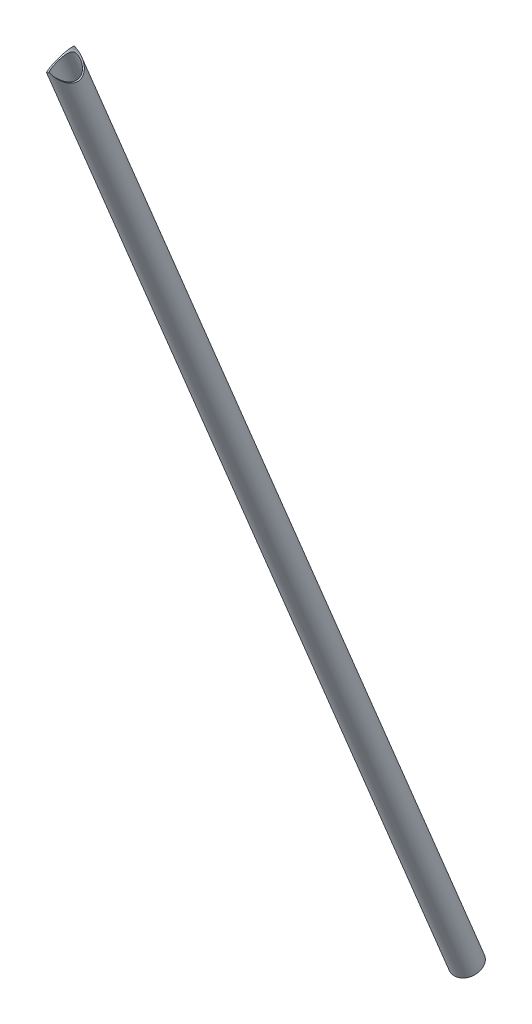
ISO-10303-21;
HEADER;
FILE_DESCRIPTION(('STEP AP214'),'2;1');
FILE_NAME('part.step','',(''),(''),'','','');
FILE_SCHEMA(('AUTOMOTIVE_DESIGN { 1 0 10303 214 1 1 1 1 }'));
ENDSEC;
DATA;
#1=APPLICATION_CONTEXT('core data for automotive mechanical design processes');
#2=APPLICATION_PROTOCOL_DEFINITION('international standard','automotive_design',2000,#1);
#3=PRODUCT_CONTEXT('',#1,'mechanical');
#4=PRODUCT('Part','Part','',(#3));
#5=PRODUCT_RELATED_PRODUCT_CATEGORY('part','',(#4));
#6=PRODUCT_DEFINITION_FORMATION('','',#4);
#7=PRODUCT_DEFINITION_CONTEXT('part definition',#1,'design');
#8=PRODUCT_DEFINITION('design','',#6,#7);
#9=PRODUCT_DEFINITION_SHAPE('','',#8);
#10=(LENGTH_UNIT() NAMED_UNIT(*) SI_UNIT(.MILLI.,.METRE.));
#11=(NAMED_UNIT(*) PLANE_ANGLE_UNIT() SI_UNIT($,.RADIAN.));
#12=(NAMED_UNIT(*) SI_UNIT($,.STERADIAN.) SOLID_ANGLE_UNIT());
#13=UNCERTAINTY_MEASURE_WITH_UNIT(LENGTH_MEASURE(1.E-05),#10,'distance_accuracy_value','');
#14=(GEOMETRIC_REPRESENTATION_CONTEXT(3) GLOBAL_UNCERTAINTY_ASSIGNED_CONTEXT((#13)) GLOBAL_UNIT_ASSIGNED_CONTEXT((#10,
#11,#12)) REPRESENTATION_CONTEXT('',''));
#15=CARTESIAN_POINT('',(0.,0.,0.));
#16=DIRECTION('',(0.,0.,1.));
#17=DIRECTION('',(1.,0.,0.));
#18=AXIS2_PLACEMENT_3D('',#15,#16,#17);
#19=CARTESIAN_POINT('',(-1.11022302462516E-13,220.,-2300.));
#20=DIRECTION('',(0.,0.924802742541058,0.380446957391614));
#21=DIRECTION('',(0.,-0.380446957391614,0.924802742541059));
#22=AXIS2_PLACEMENT_3D('',#19,#20,#21);
#23=CYLINDRICAL_SURFACE('',#22,9.79999999999998);
#24=CARTESIAN_POINT('',(-1.11022302462516E-13,220.,-2300.));
#25=DIRECTION('',(0.,-0.924802742541059,-0.380446957391614));
#26=DIRECTION('',(-0.14944830444176,0.376174363259909,-0.914416782832361));
#27=AXIS2_PLACEMENT_3D('',#24,#25,#26);
#28=CIRCLE('',#27,9.79999999999998);
#29=CARTESIAN_POINT('',(-1.46459338352935,223.686508759947,-2308.96128447176));
#30=VERTEX_POINT('',#29);
#31=EDGE_CURVE('E91',#30,#30,#28,.T.);
#32=ORIENTED_EDGE('',*,*,#31,.T.);
#33=EDGE_LOOP('',(#32));
#34=FACE_BOUND('',#33,.T.);
#35=CARTESIAN_POINT('',(-9.60359023693024,1006.91257135328,-1978.38946943885));
#36=CARTESIAN_POINT('',(-9.64365230444011,1006.7976589944,-1978.22363917368));
#37=CARTESIAN_POINT('',(-9.67786894181936,1006.68679053126,-1978.05359784801));
#38=CARTESIAN_POINT('',(-9.73402261334779,1006.47429744609,-1977.70589373125));
#39=CARTESIAN_POINT('',(-9.75596152261964,1006.37267141448,-1977.52823210843));
#40=CARTESIAN_POINT('',(-9.78712370062363,1006.17975912841,-1977.16637275888));
#41=CARTESIAN_POINT('',(-9.79635144677813,1006.08846924353,-1976.98217735709));
#42=CARTESIAN_POINT('',(-9.80187628969414,1005.91710717101,-1976.60844234207));
#43=CARTESIAN_POINT('',(-9.79817322156801,1005.83703512642,-1976.41890266074));
#44=CARTESIAN_POINT('',(-9.77783418073081,1005.68875926246,-1976.03575449786));
#45=CARTESIAN_POINT('',(-9.76118864382762,1005.62056426558,-1975.8421431104));
#46=CARTESIAN_POINT('',(-9.71520143312278,1005.49655471192,-1975.45248616531));
#47=CARTESIAN_POINT('',(-9.68585973013293,1005.4407401836,-1975.25644060207));
#48=CARTESIAN_POINT('',(-9.61493850035152,1005.34163304488,-1974.86334998296));
#49=CARTESIAN_POINT('',(-9.57335536684509,1005.29834413239,-1974.66630464936));
#50=CARTESIAN_POINT('',(-9.47860134200897,1005.2241919245,-1974.27267869454));
#51=CARTESIAN_POINT('',(-9.42543022907206,1005.19332886677,-1974.07609808228));
#52=CARTESIAN_POINT('',(-9.30872646590862,1005.14387380877,-1973.68620975318));
#53=CARTESIAN_POINT('',(-9.2452792762201,1005.12518649253,-1973.49288844494));
#54=CARTESIAN_POINT('',(-9.10853137672886,1005.09915724794,-1973.10896103572));
#55=CARTESIAN_POINT('',(-9.03522697608594,1005.09181958217,-1972.91835598149));
#56=CARTESIAN_POINT('',(-8.80175204371721,1005.08589841729,-1972.35201152867));
#57=CARTESIAN_POINT('',(-8.62795984668388,1005.10338322415,-1971.98154608296));
#58=CARTESIAN_POINT('',(-8.29439092746783,1005.16681325646,-1971.34438985109));
#59=CARTESIAN_POINT('',(-8.14074167962456,1005.20520091917,-1971.07358873513));
#60=CARTESIAN_POINT('',(-7.81791986530369,1005.30082519699,-1970.5446954976));
#61=CARTESIAN_POINT('',(-7.64874013015978,1005.35807054843,-1970.28660933039));
#62=CARTESIAN_POINT('',(-7.29629099146843,1005.48880098163,-1969.78363799283));
#63=CARTESIAN_POINT('',(-7.1129870810591,1005.56232671467,-1969.5387878104));
#64=CARTESIAN_POINT('',(-6.73396357684742,1005.72282639638,-1969.06364950693));
#65=CARTESIAN_POINT('',(-6.53824588370323,1005.80979828925,-1968.83335916738));
#66=CARTESIAN_POINT('',(-6.12925386537519,1005.99724251228,-1968.3813803));
#67=CARTESIAN_POINT('',(-5.91563421438959,1006.09803428041,-1968.16013768123));
#68=CARTESIAN_POINT('',(-5.4761894957211,1006.30810026514,-1967.7343236747));
#69=CARTESIAN_POINT('',(-5.25036125974204,1006.41737668688,-1967.52975664937));
#70=CARTESIAN_POINT('',(-4.78656616745733,1006.6407937774,-1967.13886890613));
#71=CARTESIAN_POINT('',(-4.54862497133501,1006.7549240856,-1966.95251187363));
#72=CARTESIAN_POINT('',(-4.05908743561433,1006.98402326998,-1966.59950578165));
#73=CARTESIAN_POINT('',(-3.80749936441947,1007.09899160266,-1966.43284497893));
#74=CARTESIAN_POINT('',(-3.29012151839071,1007.32333785652,-1966.12327004089));
#75=CARTESIAN_POINT('',(-3.02443550419145,1007.4327474498,-1965.98020758196));
#76=CARTESIAN_POINT('',(-2.47473125878425,1007.63833312369,-1965.72188273374));
#77=CARTESIAN_POINT('',(-2.19072143102497,1007.73451520805,-1965.60660771418));
#78=CARTESIAN_POINT('',(-1.6500359946442,1007.88736469091,-1965.42844320705));
#79=CARTESIAN_POINT('',(-1.39637267358888,1007.94790756608,-1965.36009559887));
#80=CARTESIAN_POINT('',(-1.00749870489637,1008.01780394421,-1965.28221667969));
#81=CARTESIAN_POINT('',(-0.876592393317288,1008.03760843906,-1965.26037225394));
#82=CARTESIAN_POINT('',(-0.612678463472137,1008.06927082178,-1965.22560430281));
#83=CARTESIAN_POINT('',(-0.479671968812604,1008.08113282069,-1965.21267616224));
#84=CARTESIAN_POINT('',(-0.211395102544576,1008.09627158912,-1965.19619637225));
#85=CARTESIAN_POINT('',(-0.0761151125296333,1008.09947149905,-1965.19272866411));
#86=CARTESIAN_POINT('',(0.19425028776987,1008.09685983107,-1965.19556496999));
#87=CARTESIAN_POINT('',(0.329335699313569,1008.09104831173,-1965.2018689205));
#88=CARTESIAN_POINT('',(0.598247733140953,1008.07077146161,-1965.22398446275));
#89=CARTESIAN_POINT('',(0.732072337082155,1008.05629407296,-1965.23980930221));
#90=CARTESIAN_POINT('',(0.997310292992268,1008.01952874012,-1965.28033424036));
#91=CARTESIAN_POINT('',(1.12872208531783,1007.99723591898,-1965.30503988107));
#92=CARTESIAN_POINT('',(1.59670649824207,1007.90483889546,-1965.40859435846));
#93=CARTESIAN_POINT('',(1.924496394141,1007.81537454132,-1965.51075338196));
#94=CARTESIAN_POINT('',(2.39786346377143,1007.66256427705,-1965.6937425843));
#95=CARTESIAN_POINT('',(2.55291879409498,1007.60838604943,-1965.75987508845));
#96=CARTESIAN_POINT('',(2.85747095226575,1007.49571457592,-1965.90081633983));
#97=CARTESIAN_POINT('',(3.00696848258984,1007.43722187816,-1965.97562398562));
#98=CARTESIAN_POINT('',(3.43727286439535,1007.26202475919,-1966.20583424305));
#99=CARTESIAN_POINT('',(3.71107191784729,1007.14171347758,-1966.37155881241));
#100=CARTESIAN_POINT('',(4.24250002987547,1006.89953252647,-1966.72632709368));
#101=CARTESIAN_POINT('',(4.50011511277481,1006.77766161655,-1966.9153905533));
#102=CARTESIAN_POINT('',(5.00136655987429,1006.53773073969,-1967.31448557535));
#103=CARTESIAN_POINT('',(5.2449745759458,1006.41967869898,-1967.52455745521));
#104=CARTESIAN_POINT('',(5.7184220971623,1006.19194852209,-1967.96370683641));
#105=CARTESIAN_POINT('',(5.94826591215535,1006.0822677617,-1968.19277833444));
#106=CARTESIAN_POINT('',(6.41136135818554,1005.86690537374,-1968.68730147279));
#107=CARTESIAN_POINT('',(6.64352205659704,1005.76217582818,-1968.95419587406));
#108=CARTESIAN_POINT('',(7.09096374398213,1005.57083685708,-1969.50813596712));
#109=CARTESIAN_POINT('',(7.30623939574232,1005.48423314663,-1969.79518797664));
#110=CARTESIAN_POINT('',(7.71701349958958,1005.33380490301,-1970.38723238374));
#111=CARTESIAN_POINT('',(7.91258152726376,1005.26989806716,-1970.69215519192));
#112=CARTESIAN_POINT('',(8.28173325173256,1005.16895476918,-1971.31919766881));
#113=CARTESIAN_POINT('',(8.45533466139545,1005.13189654212,-1971.64130318035));
#114=CARTESIAN_POINT('',(8.71356359100446,1005.09753671428,-1972.17064660597));
#115=CARTESIAN_POINT('',(8.80635652387899,1005.09033688574,-1972.37331136117));
#116=CARTESIAN_POINT('',(8.98142215892301,1005.08846196618,-1972.78316689494));
#117=CARTESIAN_POINT('',(9.06369822462901,1005.09378286013,-1972.99035620149));
#118=CARTESIAN_POINT('',(9.21665996284877,1005.11781889784,-1973.40812051107));
#119=CARTESIAN_POINT('',(9.28735106167095,1005.13652774862,-1973.61869387799));
#120=CARTESIAN_POINT('',(9.41614116535742,1005.18804248912,-1974.04199286654));
#121=CARTESIAN_POINT('',(9.47423980106989,1005.22084879203,-1974.25471855107));
#122=CARTESIAN_POINT('',(9.57724309167248,1005.30131654816,-1974.68229665202));
#123=CARTESIAN_POINT('',(9.62204729570096,1005.34908575864,-1974.89715318386));
#124=CARTESIAN_POINT('',(9.69705133116398,1005.4595373357,-1975.32559602385));
#125=CARTESIAN_POINT('',(9.72725124602148,1005.52221961709,-1975.53918233925));
#126=CARTESIAN_POINT('',(9.7724668810834,1005.66222411968,-1975.9630750971));
#127=CARTESIAN_POINT('',(9.78748717963894,1005.73954191828,-1976.17338250967));
#128=CARTESIAN_POINT('',(9.80210435085273,1005.90817799663,-1976.58884562171));
#129=CARTESIAN_POINT('',(9.80170238666416,1005.99949522002,-1976.79400170853));
#130=CARTESIAN_POINT('',(9.78641139445549,1006.18495665653,-1977.17644200162));
#131=CARTESIAN_POINT('',(9.77302964651493,1006.27782474408,-1977.35440968281));
#132=CARTESIAN_POINT('',(9.73424006561021,1006.47310560057,-1977.70374445408));
#133=CARTESIAN_POINT('',(9.70882823973476,1006.57552152947,-1977.87510933218));
#134=CARTESIAN_POINT('',(9.64644386484732,1006.78880704261,-1978.2102296538));
#135=CARTESIAN_POINT('',(9.60947407576525,1006.89967460391,-1978.37398690323));
#136=CARTESIAN_POINT('',(9.5245465982264,1007.12883304633,-1978.69332269145));
#137=CARTESIAN_POINT('',(9.47658472083431,1007.24712674495,-1978.84889808438));
#138=CARTESIAN_POINT('',(9.36793092688363,1007.49552873577,-1979.15822316152));
#139=CARTESIAN_POINT('',(9.30675999547687,1007.62592957906,-1979.31156942957));
#140=CARTESIAN_POINT('',(9.1739400954596,1007.89242796857,-1979.60849703358));
#141=CARTESIAN_POINT('',(9.10228709458769,1008.02852769258,-1979.75207458041));
#142=CARTESIAN_POINT('',(8.87278739155221,1008.44367647582,-1980.16794761871));
#143=CARTESIAN_POINT('',(8.7003572394607,1008.7296719067,-1980.42550213186));
#144=CARTESIAN_POINT('',(8.36556660499159,1009.24575832936,-1980.8476200727));
#145=CARTESIAN_POINT('',(8.20975687063837,1009.4738551873,-1981.02003790205));
#146=CARTESIAN_POINT('',(7.88067296352925,1009.9332112307,-1981.34264691835));
#147=CARTESIAN_POINT('',(7.70739667909954,1010.1644707956,-1981.4928354124));
#148=CARTESIAN_POINT('',(7.34467309551716,1010.62804442407,-1981.77245019257));
#149=CARTESIAN_POINT('',(7.15518180174412,1010.86035962598,-1981.9018170615));
#150=CARTESIAN_POINT('',(6.7617372174744,1011.32289900706,-1982.14053107005));
#151=CARTESIAN_POINT('',(6.55778631059671,1011.55312352385,-1982.24988149872));
#152=CARTESIAN_POINT('',(6.13109439061335,1012.01451392928,-1982.45225690207));
#153=CARTESIAN_POINT('',(5.9080203415002,1012.24557030675,-1982.54482815913));
#154=CARTESIAN_POINT('',(5.44760473136825,1012.7000812939,-1982.71174249618));
#155=CARTESIAN_POINT('',(5.21025862958486,1012.92353344847,-1982.78607973626));
#156=CARTESIAN_POINT('',(4.7214390413188,1013.3586177657,-1982.91774762235));
#157=CARTESIAN_POINT('',(4.46999830509479,1013.5702752227,-1982.97511589573));
#158=CARTESIAN_POINT('',(3.95146692007565,1013.9771424128,-1983.07452833175));
#159=CARTESIAN_POINT('',(3.68438838324366,1014.17236459713,-1983.11658417675));
#160=CARTESIAN_POINT('',(3.1365342341018,1014.53631814688,-1983.18661786193));
#161=CARTESIAN_POINT('',(2.85601983872543,1014.70539881431,-1983.21479484429));
#162=CARTESIAN_POINT('',(2.27604952535983,1015.00923047621,-1983.25992790255));
#163=CARTESIAN_POINT('',(1.97661941400694,1015.14402703346,-1983.27689891933));
#164=CARTESIAN_POINT('',(1.40854383317763,1015.34570749598,-1983.29996489527));
#165=CARTESIAN_POINT('',(1.14270471308704,1015.42003170557,-1983.30737108868));
#166=CARTESIAN_POINT('',(0.737675712902929,1015.49731831579,-1983.31474308325));
#167=CARTESIAN_POINT('',(0.601703423954677,1015.51737879008,-1983.31657754982));
#168=CARTESIAN_POINT('',(0.328474425526617,1015.54534712308,-1983.31910506005));
#169=CARTESIAN_POINT('',(0.191217762842074,1015.55325542283,-1983.31979814513));
#170=CARTESIAN_POINT('',(-0.0838974707377078,1015.55653146254,-1983.32008713438));
#171=CARTESIAN_POINT('',(-0.221756532616936,1015.55185770819,-1983.31967940818));
#172=CARTESIAN_POINT('',(-0.496475955213437,1015.53011070384,-1983.31773313365));
#173=CARTESIAN_POINT('',(-0.633336293034159,1015.51303717045,-1983.31619455947));
#174=CARTESIAN_POINT('',(-0.905275016214109,1015.46721778919,-1983.31189315431));
#175=CARTESIAN_POINT('',(-1.04035017023376,1015.43845315322,-1983.30912835207));
#176=CARTESIAN_POINT('',(-1.30779923966707,1015.37038169422,-1983.30223562899));
#177=CARTESIAN_POINT('',(-1.44017211629459,1015.33107089629,-1983.29810719405));
#178=CARTESIAN_POINT('',(-1.76268236672082,1015.22272993369,-1983.28604077776));
#179=CARTESIAN_POINT('',(-1.95100419069433,1015.14838588059,-1983.27722405549));
#180=CARTESIAN_POINT('',(-2.32033718472437,1014.98382290224,-1983.2557541694));
#181=CARTESIAN_POINT('',(-2.50134409457248,1014.89359488545,-1983.24309880541));
#182=CARTESIAN_POINT('',(-2.85671115528047,1014.7003931895,-1983.21338467825));
#183=CARTESIAN_POINT('',(-3.031049253466,1014.59738132405,-1983.19631254872));
#184=CARTESIAN_POINT('',(-3.37296522303069,1014.38149324433,-1983.15731000743));
#185=CARTESIAN_POINT('',(-3.54054062328244,1014.26861347114,-1983.13537783846));
#186=CARTESIAN_POINT('',(-3.99577676183001,1013.94539168947,-1983.06733739173));
#187=CARTESIAN_POINT('',(-4.27677112954559,1013.72680659243,-1983.0156015799));
#188=CARTESIAN_POINT('',(-4.82125575759659,1013.27347959231,-1982.89354463415));
#189=CARTESIAN_POINT('',(-5.08473356374821,1013.03872643022,-1982.82321045003));
#190=CARTESIAN_POINT('',(-5.59514293357412,1012.5583962844,-1982.66215480072));
#191=CARTESIAN_POINT('',(-5.84207202584476,1012.31281769302,-1982.57143029916));
#192=CARTESIAN_POINT('',(-6.31934631243272,1011.81494840558,-1982.3679093115));
#193=CARTESIAN_POINT('',(-6.54969790131608,1011.56266034959,-1982.25512139917));
#194=CARTESIAN_POINT('',(-6.96317986795991,1011.08901485203,-1982.02261199391));
#195=CARTESIAN_POINT('',(-7.14848520405822,1010.8680840628,-1981.90588645083));
#196=CARTESIAN_POINT('',(-7.50526871002736,1010.42575870501,-1981.65352749712));
#197=CARTESIAN_POINT('',(-7.67674593193356,1010.20436410574,-1981.51789279194));
#198=CARTESIAN_POINT('',(-8.00421314429797,1009.76374909009,-1981.22692488699));
#199=CARTESIAN_POINT('',(-8.16022856257064,1009.54452565621,-1981.07162501923));
#200=CARTESIAN_POINT('',(-8.45529674617677,1009.11042327802,-1980.74026836929));
#201=CARTESIAN_POINT('',(-8.59435594678996,1008.89554271149,-1980.56421951203));
#202=CARTESIAN_POINT('',(-8.82193391511745,1008.52431135718,-1980.23610794822));
#203=CARTESIAN_POINT('',(-8.91452542547062,1008.36641897429,-1980.08860226526));
#204=CARTESIAN_POINT('',(-9.08769219367698,1008.05624486577,-1979.78130353756));
#205=CARTESIAN_POINT('',(-9.16827453985336,1007.90395987071,-1979.62151782613));
#206=CARTESIAN_POINT('',(-9.3163267676213,1007.60656579528,-1979.28981807258));
#207=CARTESIAN_POINT('',(-9.38380434933338,1007.46145253852,-1979.11791123406));
#208=CARTESIAN_POINT('',(-9.50458566910346,1007.1799966492,-1978.76231833767));
#209=CARTESIAN_POINT('',(-9.5578910447992,1007.04365300466,-1978.5786336438));
#210=CARTESIAN_POINT('',(-9.60359023693024,1006.91257135328,-1978.38946943885));
#211=B_SPLINE_CURVE_WITH_KNOTS('',3,(#35,#36,#37,#38,#39,#40,#41,#42,#43,#44,#45,#46,#47,#48,
#49,#50,#51,#52,#53,#54,#55,#56,#57,#58,#59,#60,#61,#62,#63,#64,#65,#66,#67,#68,#69,#70,#71,#72,
#73,#74,#75,#76,#77,#78,#79,#80,#81,#82,#83,#84,#85,#86,#87,#88,#89,#90,#91,#92,#93,#94,#95,#96,
#97,#98,#99,#100,#101,#102,#103,#104,#105,#106,#107,#108,#109,#110,#111,#112,#113,#114,#115,
#116,#117,#118,#119,#120,#121,#122,#123,#124,#125,#126,#127,#128,#129,#130,#131,#132,#133,#134,
#135,#136,#137,#138,#139,#140,#141,#142,#143,#144,#145,#146,#147,#148,#149,#150,#151,#152,#153,
#154,#155,#156,#157,#158,#159,#160,#161,#162,#163,#164,#165,#166,#167,#168,#169,#170,#171,#172,
#173,#174,#175,#176,#177,#178,#179,#180,#181,#182,#183,#184,#185,#186,#187,#188,#189,#190,#191,
#192,#193,#194,#195,#196,#197,#198,#199,#200,#201,#202,#203,#204,#205,#206,#207,#208,#209,#210),
.UNSPECIFIED.,.T.,.F.,(4,2,2,2,2,2,2,2,2,2,2,2,2,2,2,2,2,2,2,2,2,2,2,2,2,2,2,2,2,2,2,2,2,2,2,2,
2,2,2,2,2,2,2,2,2,2,2,2,2,2,2,2,2,2,2,2,2,2,2,2,2,2,2,2,2,2,2,2,2,2,2,2,2,2,2,2,2,2,2,2,2,2,2,2,
2,2,2,4),(0.,0.616892530113202,1.23369081925123,1.85027178970374,2.4668606225337,
3.08390553413933,3.70095186432498,4.31818017825506,4.935420297026,5.54776846227693,
6.16034655111693,7.38488742164459,8.32487808726231,9.26530484294278,10.2081068210559,
11.1507647948169,12.1208791345221,13.0912464522284,14.0596373717967,15.0274479751902,
15.988922421644,16.9499590200564,17.7555028321836,18.157591628401,18.5594721418367,
18.9649070703235,19.3703393633037,19.7763370984667,20.1825886350603,21.2400211757989,
21.7710680984296,22.3020476697067,23.3262044933657,24.3512339041446,25.3782696496598,
26.4049821098065,27.5104487741499,28.6162634701731,29.7180263407984,30.8188950611069,
31.4873831904651,32.1556569841109,32.8236168633016,33.4915963212885,34.1645014257039,
34.8374026862895,35.5101009313009,36.1827484412426,36.7856124449535,37.3886766861032,
37.9915970311898,38.5947475241981,39.2252758770856,39.8560474237017,41.1171179297059,
42.092825346061,43.0686508654511,44.0472134641073,45.025615123385,46.0274494713155,
47.0296042646354,48.0295199046768,49.0286710688099,50.0130348265296,50.9960834706142,
51.8208440772177,52.2327364914782,52.6446139567072,53.0578514136394,53.4710983147952,
53.8850119637162,54.2990818383885,54.9060340331537,55.5133347673003,56.1224953073332,
56.7318764589583,57.8094926368384,58.8878669765009,59.9664020045811,61.0445187461292,
61.9769641347292,62.909473391412,63.8404227083731,64.7710176013525,65.4756268834727,
66.1798186136721,66.8835953134115,67.5872906544193),.UNSPECIFIED.);
#212=CARTESIAN_POINT('',(-9.60359023693024,1006.91257135328,-1978.38946943885));
#213=VERTEX_POINT('',#212);
#214=EDGE_CURVE('E46',#213,#213,#211,.T.);
#215=ORIENTED_EDGE('',*,*,#214,.T.);
#216=EDGE_LOOP('',(#215));
#217=FACE_BOUND('',#216,.T.);
#218=ADVANCED_FACE('F41',(#34,#217),#23,.F.);
#219=CARTESIAN_POINT('',(-1.11022302462516E-13,220.,-2300.));
#220=DIRECTION('',(0.,0.924802742541058,0.380446957391614));
#221=DIRECTION('',(0.,-0.380446957391614,0.924802742541059));
#222=AXIS2_PLACEMENT_3D('',#219,#220,#221);
#223=CYLINDRICAL_SURFACE('',#222,11.);
#224=CARTESIAN_POINT('',(-1.11022302462516E-13,220.,-2300.));
#225=DIRECTION('',(0.,-0.924802742541059,-0.380446957391614));
#226=DIRECTION('',(-0.14944830444176,0.376174363259909,-0.914416782832361));
#227=AXIS2_PLACEMENT_3D('',#224,#225,#226);
#228=CIRCLE('',#227,11.);
#229=CARTESIAN_POINT('',(-1.64393134885947,224.137917995859,-2310.05858461116));
#230=VERTEX_POINT('',#229);
#231=EDGE_CURVE('E63',#230,#230,#228,.T.);
#232=ORIENTED_EDGE('',*,*,#231,.F.);
#233=EDGE_LOOP('',(#232));
#234=FACE_BOUND('',#233,.T.);
#235=CARTESIAN_POINT('',(-1.18687778030713E-13,1020.63206073329,-1982.52902160579));
#236=CARTESIAN_POINT('',(-0.00515471055095744,1020.62742499272,-1982.53092866347));
#237=CARTESIAN_POINT('',(-0.0103093292578846,1020.62278773058,-1982.53283243051));
#238=CARTESIAN_POINT('',(-0.440616414545313,1020.23553558094,-1982.69148688348));
#239=CARTESIAN_POINT('',(-0.865121979259571,1019.84258888535,-1982.82584864598));
#240=CARTESIAN_POINT('',(-1.70952443637622,1019.03870281787,-1983.04898096187));
#241=CARTESIAN_POINT('',(-2.12941731775094,1018.62774913141,-1983.1377145027));
#242=CARTESIAN_POINT('',(-2.96223502494686,1017.7894272037,-1983.26839357438));
#243=CARTESIAN_POINT('',(-3.37513975186292,1017.36202040836,-1983.31022129715));
#244=CARTESIAN_POINT('',(-4.18925267717053,1016.49451679913,-1983.34475323002));
#245=CARTESIAN_POINT('',(-4.59046643392696,1016.05442622034,-1983.33748117989));
#246=CARTESIAN_POINT('',(-5.27848651839499,1015.27619581412,-1983.27951573501));
#247=CARTESIAN_POINT('',(-5.56871921573428,1014.94021030683,-1983.24018628778));
#248=CARTESIAN_POINT('',(-6.13856313974478,1014.26409774177,-1983.13103688073));
#249=CARTESIAN_POINT('',(-6.4181741547619,1013.92397060164,-1983.06121631369));
#250=CARTESIAN_POINT('',(-6.96388998349826,1013.24206551233,-1982.88949578209));
#251=CARTESIAN_POINT('',(-7.23002021033764,1012.90029210902,-1982.7876590008));
#252=CARTESIAN_POINT('',(-7.7465276509372,1012.21674453809,-1982.54980922194));
#253=CARTESIAN_POINT('',(-7.99691027130486,1011.87497041147,-1982.41380803497));
#254=CARTESIAN_POINT('',(-8.40939701774432,1011.29204655502,-1982.14958327857));
#255=CARTESIAN_POINT('',(-8.57622117885758,1011.05015564484,-1982.0303198295));
#256=CARTESIAN_POINT('',(-8.89864215527205,1010.56923204477,-1981.77232151234));
#257=CARTESIAN_POINT('',(-9.05423951186609,1010.33019921755,-1981.63358758396));
#258=CARTESIAN_POINT('',(-9.35232899983836,1009.85691593615,-1981.33590859749));
#259=CARTESIAN_POINT('',(-9.49483270994255,1009.62266140199,-1981.17698169832));
#260=CARTESIAN_POINT('',(-9.76485862611614,1009.16086573134,-1980.83808073319));
#261=CARTESIAN_POINT('',(-9.89238613928665,1008.9333222382,-1980.65811416843));
#262=CARTESIAN_POINT('',(-10.1038874790173,1008.53686451799,-1980.31887344209));
#263=CARTESIAN_POINT('',(-10.191252742983,1008.36612417505,-1980.16384053671));
#264=CARTESIAN_POINT('',(-10.3543662248395,1008.03173870812,-1979.84071453915));
#265=CARTESIAN_POINT('',(-10.4301209727457,1007.86808963327,-1979.67262886889));
#266=CARTESIAN_POINT('',(-10.5688610248736,1007.54941990092,-1979.3235406971));
#267=CARTESIAN_POINT('',(-10.6318492381572,1007.3943972836,-1979.14254115095));
#268=CARTESIAN_POINT('',(-10.7439099093822,1007.09466444883,-1978.76807395103));
#269=CARTESIAN_POINT('',(-10.7929822186015,1006.94995434161,-1978.57460616403));
#270=CARTESIAN_POINT('',(-10.8765118823903,1006.67141175405,-1978.17429746609));
#271=CARTESIAN_POINT('',(-10.9108351747103,1006.53768763581,-1977.96735279346));
#272=CARTESIAN_POINT('',(-10.9633395227386,1006.28438083561,-1977.54299271077));
#273=CARTESIAN_POINT('',(-10.9815205842197,1006.1647981486,-1977.32557730445));
#274=CARTESIAN_POINT('',(-11.0011665174091,1005.94147697767,-1976.88219008201));
#275=CARTESIAN_POINT('',(-11.0026421850974,1005.83772830367,-1976.65622388666));
#276=CARTESIAN_POINT('',(-10.9887393460218,1005.64728897499,-1976.19773296342));
#277=CARTESIAN_POINT('',(-10.9733628996488,1005.56059623652,-1975.96520904068));
#278=CARTESIAN_POINT('',(-10.9292667062822,1005.41568294842,-1975.52786881808));
#279=CARTESIAN_POINT('',(-10.902646042768,1005.35519365228,-1975.32358502743));
#280=CARTESIAN_POINT('',(-10.8374730716224,1005.24779318626,-1974.91335641618));
#281=CARTESIAN_POINT('',(-10.7989205454964,1005.20088226506,-1974.70741156523));
#282=CARTESIAN_POINT('',(-10.7105030211445,1005.1206022743,-1974.29531576266));
#283=CARTESIAN_POINT('',(-10.6606373008358,1005.0872340695,-1974.08916479872));
#284=CARTESIAN_POINT('',(-10.5503564000211,1005.03375040221,-1973.6779767051));
#285=CARTESIAN_POINT('',(-10.4899405802978,1005.01363574309,-1973.47293964367));
#286=CARTESIAN_POINT('',(-10.3576883876248,1004.98581392399,-1973.05976416641));
#287=CARTESIAN_POINT('',(-10.2855935089115,1004.97844688691,-1972.85168594574));
#288=CARTESIAN_POINT('',(-10.1321204944556,1004.97647474941,-1972.4388942606));
#289=CARTESIAN_POINT('',(-10.0507396199498,1004.98187342334,-1972.23418180927));
#290=CARTESIAN_POINT('',(-9.79410986783974,1005.01606659164,-1971.62643611105));
#291=CARTESIAN_POINT('',(-9.60632378988491,1005.06284906524,-1971.22964106648));
#292=CARTESIAN_POINT('',(-9.08189298680684,1005.23891965389,-1970.22219600612));
#293=CARTESIAN_POINT('',(-8.72416223525944,1005.40107813678,-1969.62821071101));
#294=CARTESIAN_POINT('',(-8.15295442802933,1005.70577631218,-1968.78387184551));
#295=CARTESIAN_POINT('',(-7.95639426541608,1005.8178457371,-1968.50974318476));
#296=CARTESIAN_POINT('',(-7.55349907223989,1006.06013108436,-1967.97702078944));
#297=CARTESIAN_POINT('',(-7.34716431157224,1006.19034650585,-1967.71842662637));
#298=CARTESIAN_POINT('',(-6.83210172897073,1006.5286499067,-1967.10438647567));
#299=CARTESIAN_POINT('',(-6.51893367061073,1006.74548079384,-1966.75748386313));
#300=CARTESIAN_POINT('',(-5.87944282045122,1007.20714896651,-1966.09581004392));
#301=CARTESIAN_POINT('',(-5.55311364403411,1007.45199995338,-1965.7810547003));
#302=CARTESIAN_POINT('',(-4.89018914954965,1007.96549067499,-1965.18320016259));
#303=CARTESIAN_POINT('',(-4.553590530991,1008.2341381116,-1964.90011128513));
#304=CARTESIAN_POINT('',(-3.87257824504928,1008.79172454273,-1964.36541076059));
#305=CARTESIAN_POINT('',(-3.52816683662647,1009.08065772127,-1964.11379014856));
#306=CARTESIAN_POINT('',(-2.92165409875978,1009.60046457035,-1963.70185470261));
#307=CARTESIAN_POINT('',(-2.66088748627512,1009.82742402414,-1963.53459020932));
#308=CARTESIAN_POINT('',(-2.13664826668943,1010.29025212942,-1963.2175230883));
#309=CARTESIAN_POINT('',(-1.87317519635825,1010.5261223252,-1963.06772350588));
#310=CARTESIAN_POINT('',(-1.08062627145202,1011.24497196484,-1962.64531615781));
#311=CARTESIAN_POINT('',(-0.548202172715866,1011.74023761172,-1962.39887486801));
#312=CARTESIAN_POINT('',(-0.00974071323224675,1012.25294983532,-1962.1871815037));
#313=CARTESIAN_POINT('',(-0.00487040397547197,1012.25758822082,-1962.18526985903));
#314=CARTESIAN_POINT('',(-1.03356826894319E-13,1012.26222767067,-1962.18336126989));
#315=B_SPLINE_CURVE_WITH_KNOTS('',3,(#235,#236,#237,#238,#239,#240,#241,#242,#243,#244,#245,
#246,#247,#248,#249,#250,#251,#252,#253,#254,#255,#256,#257,#258,#259,#260,#261,#262,#263,#264,
#265,#266,#267,#268,#269,#270,#271,#272,#273,#274,#275,#276,#277,#278,#279,#280,#281,#282,#283,
#284,#285,#286,#287,#288,#289,#290,#291,#292,#293,#294,#295,#296,#297,#298,#299,#300,#301,#302,
#303,#304,#305,#306,#307,#308,#309,#310,#311,#312,#313,#314),.UNSPECIFIED.,.F.,.F.,(4,2,2,2,2,2,
2,2,2,2,2,2,2,2,2,2,2,2,2,2,2,2,2,2,2,2,2,2,2,2,2,2,2,2,2,2,2,2,2,4),(0.,0.0215705221060876,
1.8007383818652,3.58134719458443,5.36641821602872,7.15062621583254,8.48673103460542,
9.82286246346307,11.1563734468656,12.4894240697078,13.4400785928614,14.3906872501747,
15.3404470257553,16.2898692136861,17.0290738746414,17.7678612524601,18.5064800958627,
19.2451068327439,19.9903122182127,20.73551733718,21.4802408345005,22.2248732898065,
22.8682360777751,23.5116106476136,24.1550262934272,24.7984809365175,25.4588533029344,
26.1194209420238,27.4400757088327,29.5637264241218,30.6294328765548,31.6951099199331,
33.2384639176492,34.782575839413,36.3271893616188,37.8713618334745,39.0229576296837,
40.1747539277633,42.4729507157478,42.4939268949634),.UNSPECIFIED.);
#316=CARTESIAN_POINT('',(-1.18687778030713E-13,1020.63206073329,-1982.52902160579));
#317=VERTEX_POINT('',#316);
#318=CARTESIAN_POINT('',(-1.03356826894319E-13,1012.26222767067,-1962.18336126989));
#319=VERTEX_POINT('',#318);
#320=EDGE_CURVE('E56',#317,#319,#315,.T.);
#321=ORIENTED_EDGE('',*,*,#320,.F.);
#322=CARTESIAN_POINT('',(-1.03356826894319E-13,1012.26222767067,-1962.18336126989));
#323=CARTESIAN_POINT('',(0.00487042047845416,1012.25758820412,-1962.18526986501));
#324=CARTESIAN_POINT('',(0.00974072963798952,1012.25294981872,-1962.18718150967));
#325=CARTESIAN_POINT('',(0.451037350797212,1011.83275609748,-1962.36067505969));
#326=CARTESIAN_POINT('',(0.886552016442099,1011.42590113497,-1962.55673247229));
#327=CARTESIAN_POINT('',(1.75292875402433,1010.632741661,-1962.99621330354));
#328=CARTESIAN_POINT('',(2.18378655410486,1010.24645492119,-1963.23967686339));
#329=CARTESIAN_POINT('',(3.03881187817465,1009.49739172172,-1963.77372374405));
#330=CARTESIAN_POINT('',(3.46296252795,1009.13466906054,-1964.0644099266));
#331=CARTESIAN_POINT('',(4.30024171724237,1008.43832200002,-1964.69232529538));
#332=CARTESIAN_POINT('',(4.71337695836057,1008.10467961475,-1965.02952537496));
#333=CARTESIAN_POINT('',(5.38965693109232,1007.57754129573,-1965.63087122276));
#334=CARTESIAN_POINT('',(5.65693914748209,1007.37437202905,-1965.88195568554));
#335=CARTESIAN_POINT('',(6.18347009483128,1006.98567208381,-1966.40542651302));
#336=CARTESIAN_POINT('',(6.44271886860463,1006.80014131124,-1966.67781276417));
#337=CARTESIAN_POINT('',(6.95079301500154,1006.44974967144,-1967.24357839807));
#338=CARTESIAN_POINT('',(7.19963819144969,1006.28484821922,-1967.53691471909));
#339=CARTESIAN_POINT('',(7.6850685754266,1005.97854239281,-1968.14520990428));
#340=CARTESIAN_POINT('',(7.92165774678482,1005.83713038861,-1968.46016169998));
#341=CARTESIAN_POINT('',(8.31549332140818,1005.61744874985,-1969.02041808662));
#342=CARTESIAN_POINT('',(8.47642142916169,1005.53258163379,-1969.26056044293));
#343=CARTESIAN_POINT('',(8.78897682067567,1005.37876236359,-1969.75180517358));
#344=CARTESIAN_POINT('',(8.94060447495243,1005.30980957513,-1970.00290711061));
#345=CARTESIAN_POINT('',(9.23276803796935,1005.18977305185,-1970.5153560967));
#346=CARTESIAN_POINT('',(9.373313687417,1005.13867348596,-1970.77669383941));
#347=CARTESIAN_POINT('',(9.6414999453206,1005.05632190521,-1971.308921067));
#348=CARTESIAN_POINT('',(9.76914522653135,1005.02506268199,-1971.57980704504));
#349=CARTESIAN_POINT('',(9.98350469860197,1004.98884237356,-1972.07057453004));
#350=CARTESIAN_POINT('',(10.0731152267561,1004.97966898267,-1972.28888415623));
#351=CARTESIAN_POINT('',(10.2418839047677,1004.97580034516,-1972.7295350182));
#352=CARTESIAN_POINT('',(10.3210479054624,1004.98109695787,-1972.95187391722));
#353=CARTESIAN_POINT('',(10.4677824233648,1005.00701694179,-1973.39940822128));
#354=CARTESIAN_POINT('',(10.5353569510312,1005.02763499789,-1973.6246026091));
#355=CARTESIAN_POINT('',(10.6578148096439,1005.08486449632,-1974.07643732683));
#356=CARTESIAN_POINT('',(10.7126980351081,1005.12147607156,-1974.30307766873));
#357=CARTESIAN_POINT('',(10.8090971727349,1005.21139822011,-1974.75765703453));
#358=CARTESIAN_POINT('',(10.8505155600178,1005.26482533948,-1974.98559387442));
#359=CARTESIAN_POINT('',(10.9186259221749,1005.38831424493,-1975.43916723968));
#360=CARTESIAN_POINT('',(10.9453179000499,1005.45837602762,-1975.66480376552));
#361=CARTESIAN_POINT('',(10.983449300995,1005.61470596617,-1976.11164319704));
#362=CARTESIAN_POINT('',(10.9948929178551,1005.70096965853,-1976.33284730527));
#363=CARTESIAN_POINT('',(11.0023746918029,1005.88888969258,-1976.76887158594));
#364=CARTESIAN_POINT('',(10.9984138808061,1005.99054500276,-1976.98369218501));
#365=CARTESIAN_POINT('',(10.9765456361044,1006.19630043224,-1977.38237144394));
#366=CARTESIAN_POINT('',(10.9601904064665,1006.29895118389,-1977.56706856571));
#367=CARTESIAN_POINT('',(10.9157498441192,1006.51457539125,-1977.92895400958));
#368=CARTESIAN_POINT('',(10.8876601811567,1006.62755264561,-1978.10613953314));
#369=CARTESIAN_POINT('',(10.8202834193148,1006.86268105047,-1978.45207048718));
#370=CARTESIAN_POINT('',(10.7809964803964,1006.9848320699,-1978.62081603819));
#371=CARTESIAN_POINT('',(10.6918759527723,1007.23718134966,-1978.94928167649));
#372=CARTESIAN_POINT('',(10.6420401831685,1007.36738127009,-1979.10899988878));
#373=CARTESIAN_POINT('',(10.5154297743402,1007.67647992361,-1979.46743789707));
#374=CARTESIAN_POINT('',(10.4351031730469,1007.85788483879,-1979.66275311923));
#375=CARTESIAN_POINT('',(10.2592291663791,1008.23024928166,-1980.03669767183));
#376=CARTESIAN_POINT('',(10.1636778712419,1008.42121124251,-1980.21532271952));
#377=CARTESIAN_POINT('',(9.95890780317473,1008.8108157784,-1980.55609583687));
#378=CARTESIAN_POINT('',(9.84967184357266,1009.00946779076,-1980.71822271399));
#379=CARTESIAN_POINT('',(9.61917419698223,1009.41245253545,-1981.02607769917));
#380=CARTESIAN_POINT('',(9.49790902393946,1009.6167869021,-1981.17180102723));
#381=CARTESIAN_POINT('',(9.1975149694649,1010.10666367143,-1981.498742002));
#382=CARTESIAN_POINT('',(9.01368401840766,1010.39404688531,-1981.67290315878));
#383=CARTESIAN_POINT('',(8.62921433403674,1010.97342218514,-1981.99265779566));
#384=CARTESIAN_POINT('',(8.42856965058017,1011.26541587275,-1982.13824110104));
#385=CARTESIAN_POINT('',(8.01285423013209,1011.85193463812,-1982.40257487564));
#386=CARTESIAN_POINT('',(7.797762801726,1012.14646279621,-1982.5212857462));
#387=CARTESIAN_POINT('',(7.3556581035184,1012.73567791077,-1982.7330978404));
#388=CARTESIAN_POINT('',(7.12864486116249,1013.03036486687,-1982.82619912299));
#389=CARTESIAN_POINT('',(6.57870052345339,1013.72715765315,-1983.01812315325));
#390=CARTESIAN_POINT('',(6.25133233811822,1014.12870512778,-1983.10633972765));
#391=CARTESIAN_POINT('',(5.58151366689228,1014.92635112555,-1983.24030344213));
#392=CARTESIAN_POINT('',(5.23905699206305,1015.32244732361,-1983.28603298194));
#393=CARTESIAN_POINT('',(4.54237969758245,1016.10665456725,-1983.33734802296));
#394=CARTESIAN_POINT('',(4.18816076470022,1016.49476674497,-1983.34293925544));
#395=CARTESIAN_POINT('',(3.47076808860259,1017.26092144655,-1983.31582682005));
#396=CARTESIAN_POINT('',(3.10759747602917,1017.63896739725,-1983.28313635938));
#397=CARTESIAN_POINT('',(2.29373536051005,1018.46546214537,-1983.16957569302));
#398=CARTESIAN_POINT('',(1.84139871137379,1018.91105969882,-1983.07967324153));
#399=CARTESIAN_POINT('',(0.931436080596729,1019.78113890204,-1982.84670597357));
#400=CARTESIAN_POINT('',(0.473820057203869,1020.20565417807,-1982.70372911474));
#401=CARTESIAN_POINT('',(0.0103093277745276,1020.62278773185,-1982.53283242962));
#402=CARTESIAN_POINT('',(0.00515470907646922,1020.62742499398,-1982.53092866257));
#403=CARTESIAN_POINT('',(-1.18687778030713E-13,1020.63206073329,-1982.52902160579));
#404=B_SPLINE_CURVE_WITH_KNOTS('',3,(#322,#323,#324,#325,#326,#327,#328,#329,#330,#331,#332,
#333,#334,#335,#336,#337,#338,#339,#340,#341,#342,#343,#344,#345,#346,#347,#348,#349,#350,#351,
#352,#353,#354,#355,#356,#357,#358,#359,#360,#361,#362,#363,#364,#365,#366,#367,#368,#369,#370,
#371,#372,#373,#374,#375,#376,#377,#378,#379,#380,#381,#382,#383,#384,#385,#386,#387,#388,#389,
#390,#391,#392,#393,#394,#395,#396,#397,#398,#399,#400,#401,#402,#403),.UNSPECIFIED.,.F.,.F.,(4,
2,2,2,2,2,2,2,2,2,2,2,2,2,2,2,2,2,2,2,2,2,2,2,2,2,2,2,2,2,2,2,2,2,2,2,2,2,2,2,4),(0.,
0.0209761792156467,1.90068689986942,3.78199624346901,5.66745985498987,7.55174892120402,
8.8086118693091,10.0654681178566,11.3198114549747,12.5737465474235,13.4769180919187,
14.3800536319969,15.2823862862297,16.1843909183671,16.8922424675997,17.5996958689448,
18.3069039647132,19.0141179381453,19.7263456463286,20.4385732093778,21.1506048464685,
21.8625887866327,22.4976895283947,23.1330248430278,23.7683510818975,24.4038087985975,
25.2377957117254,26.0719960431561,26.9072547582542,27.7427562416277,28.890145324419,
30.0379421808012,31.187419553874,32.336894280814,33.9112659486898,35.4862895101402,
37.061088172236,38.6353436877413,40.5566307150887,42.4747477993558,42.4963183214619),.UNSPECIFIED.);
#405=EDGE_CURVE('E11',#319,#317,#404,.T.);
#406=ORIENTED_EDGE('',*,*,#405,.F.);
#407=EDGE_LOOP('',(#321,#406));
#408=FACE_BOUND('',#407,.T.);
#409=ADVANCED_FACE('F65',(#234,#408),#223,.T.);
#410=CARTESIAN_POINT('',(-1.11022302462516E-13,220.,-2300.));
#411=DIRECTION('',(0.,-0.924802742541059,-0.380446957391614));
#412=DIRECTION('',(-0.14944830444176,0.376174363259909,-0.914416782832361));
#413=AXIS2_PLACEMENT_3D('',#410,#411,#412);
#414=PLANE('',#413);
#415=ORIENTED_EDGE('',*,*,#31,.F.);
#416=EDGE_LOOP('',(#415));
#417=FACE_BOUND('',#416,.T.);
#418=ORIENTED_EDGE('',*,*,#231,.T.);
#419=EDGE_LOOP('',(#418));
#420=FACE_BOUND('',#419,.T.);
#421=ADVANCED_FACE('F67',(#417,#420),#414,.T.);
#422=CARTESIAN_POINT('',(0.,904.255410655569,-1942.29450703663));
#423=DIRECTION('',(0.,0.258819045102518,0.965925826289069));
#424=DIRECTION('',(0.,-0.965925826289069,0.258819045102518));
#425=AXIS2_PLACEMENT_3D('',#422,#423,#424);
#426=TOROIDAL_SURFACE('',#425,116.149429379517,11.);
#427=ORIENTED_EDGE('',*,*,#214,.F.);
#428=EDGE_LOOP('',(#427));
#429=FACE_BOUND('',#428,.T.);
#430=ORIENTED_EDGE('',*,*,#320,.T.);
#431=ORIENTED_EDGE('',*,*,#405,.T.);
#432=EDGE_LOOP('',(#430,#431));
#433=FACE_BOUND('',#432,.T.);
#434=ADVANCED_FACE('F43',(#429,#433),#426,.F.);
#435=CLOSED_SHELL('',(#218,#409,#421,#434));
#436=MANIFOLD_SOLID_BREP('B2',#435);
#437=ADVANCED_BREP_SHAPE_REPRESENTATION('',(#18,#436),#14);
#438=SHAPE_DEFINITION_REPRESENTATION(#9,#437);
ENDSEC;
END-ISO-10303-21;
